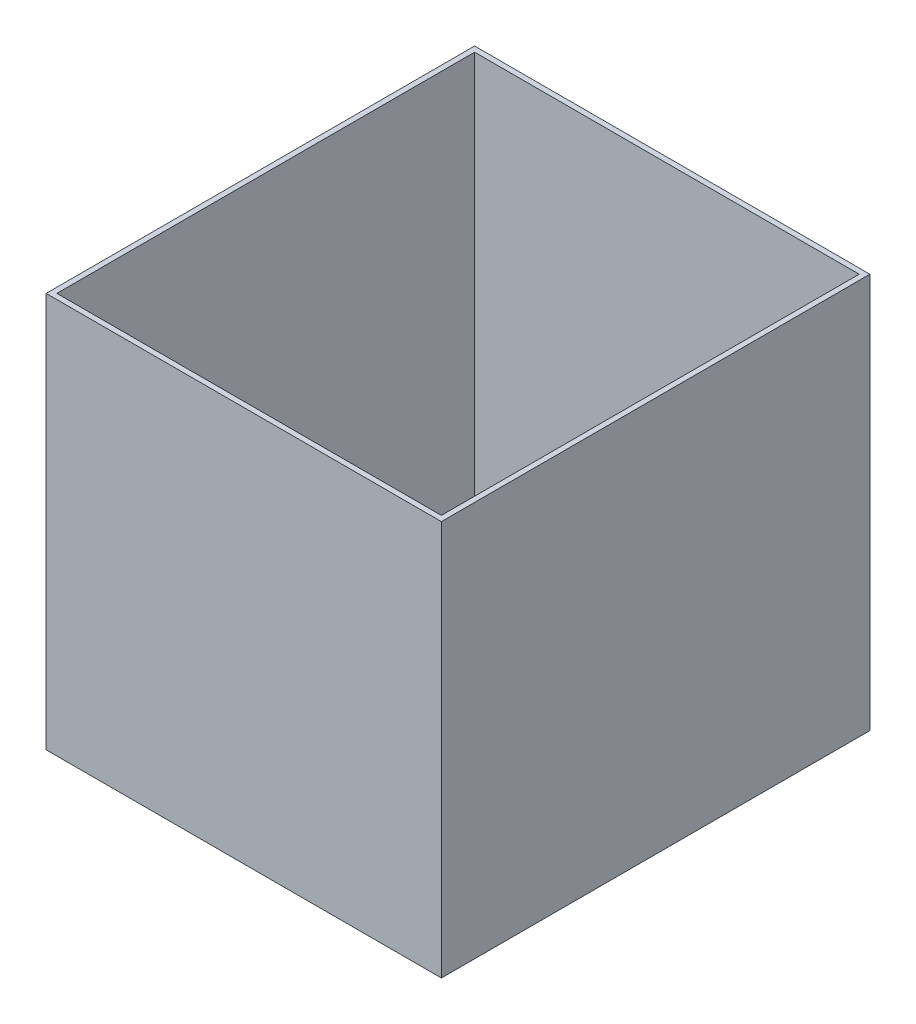
ISO-10303-21;
HEADER;
FILE_DESCRIPTION(('STEP AP214'),'2;1');
FILE_NAME('part.step','',(''),(''),'','','');
FILE_SCHEMA(('AUTOMOTIVE_DESIGN { 1 0 10303 214 1 1 1 1 }'));
ENDSEC;
DATA;
#1=APPLICATION_CONTEXT('core data for automotive mechanical design processes');
#2=APPLICATION_PROTOCOL_DEFINITION('international standard','automotive_design',2000,#1);
#3=PRODUCT_CONTEXT('',#1,'mechanical');
#4=PRODUCT('Part','Part','',(#3));
#5=PRODUCT_RELATED_PRODUCT_CATEGORY('part','',(#4));
#6=PRODUCT_DEFINITION_FORMATION('','',#4);
#7=PRODUCT_DEFINITION_CONTEXT('part definition',#1,'design');
#8=PRODUCT_DEFINITION('design','',#6,#7);
#9=PRODUCT_DEFINITION_SHAPE('','',#8);
#10=(LENGTH_UNIT() NAMED_UNIT(*) SI_UNIT(.MILLI.,.METRE.));
#11=(NAMED_UNIT(*) PLANE_ANGLE_UNIT() SI_UNIT($,.RADIAN.));
#12=(NAMED_UNIT(*) SI_UNIT($,.STERADIAN.) SOLID_ANGLE_UNIT());
#13=UNCERTAINTY_MEASURE_WITH_UNIT(LENGTH_MEASURE(1.E-05),#10,'distance_accuracy_value','');
#14=(GEOMETRIC_REPRESENTATION_CONTEXT(3) GLOBAL_UNCERTAINTY_ASSIGNED_CONTEXT((#13)) GLOBAL_UNIT_ASSIGNED_CONTEXT((#10,
#11,#12)) REPRESENTATION_CONTEXT('',''));
#15=CARTESIAN_POINT('',(0.,0.,0.));
#16=DIRECTION('',(0.,0.,1.));
#17=DIRECTION('',(1.,0.,0.));
#18=AXIS2_PLACEMENT_3D('',#15,#16,#17);
#19=CARTESIAN_POINT('',(0.,369.,-400.));
#20=DIRECTION('',(1.,0.,0.));
#21=DIRECTION('',(0.,0.,-1.));
#22=AXIS2_PLACEMENT_3D('',#19,#20,#21);
#23=PLANE('',#22);
#24=DIRECTION('',(0.,0.,1.));
#25=VECTOR('',#24,1.);
#26=CARTESIAN_POINT('',(0.,0.,-400.));
#27=LINE('',#26,#25);
#28=CARTESIAN_POINT('',(0.,0.,-400.));
#29=VERTEX_POINT('',#28);
#30=CARTESIAN_POINT('',(0.,0.,0.));
#31=VERTEX_POINT('',#30);
#32=EDGE_CURVE('E153',#29,#31,#27,.T.);
#33=ORIENTED_EDGE('',*,*,#32,.T.);
#34=DIRECTION('',(0.,-1.,0.));
#35=VECTOR('',#34,1.);
#36=CARTESIAN_POINT('',(0.,369.,0.));
#37=LINE('',#36,#35);
#38=CARTESIAN_POINT('',(0.,369.,0.));
#39=VERTEX_POINT('',#38);
#40=EDGE_CURVE('E11',#39,#31,#37,.T.);
#41=ORIENTED_EDGE('',*,*,#40,.F.);
#42=DIRECTION('',(0.,0.,1.));
#43=VECTOR('',#42,1.);
#44=CARTESIAN_POINT('',(0.,369.,-400.));
#45=LINE('',#44,#43);
#46=CARTESIAN_POINT('',(0.,369.,-400.));
#47=VERTEX_POINT('',#46);
#48=EDGE_CURVE('E146',#47,#39,#45,.T.);
#49=ORIENTED_EDGE('',*,*,#48,.F.);
#50=DIRECTION('',(0.,-1.,0.));
#51=VECTOR('',#50,1.);
#52=CARTESIAN_POINT('',(0.,369.,-400.));
#53=LINE('',#52,#51);
#54=EDGE_CURVE('E152',#47,#29,#53,.T.);
#55=ORIENTED_EDGE('',*,*,#54,.T.);
#56=EDGE_LOOP('',(#33,#41,#49,#55));
#57=FACE_BOUND('',#56,.T.);
#58=ADVANCED_FACE('F39',(#57),#23,.F.);
#59=CARTESIAN_POINT('',(0.,369.,0.));
#60=DIRECTION('',(0.,0.,-1.));
#61=DIRECTION('',(-1.,0.,0.));
#62=AXIS2_PLACEMENT_3D('',#59,#60,#61);
#63=PLANE('',#62);
#64=DIRECTION('',(1.,0.,0.));
#65=VECTOR('',#64,1.);
#66=CARTESIAN_POINT('',(0.,0.,0.));
#67=LINE('',#66,#65);
#68=CARTESIAN_POINT('',(369.,0.,0.));
#69=VERTEX_POINT('',#68);
#70=EDGE_CURVE('E156',#31,#69,#67,.T.);
#71=ORIENTED_EDGE('',*,*,#70,.T.);
#72=DIRECTION('',(0.,-1.,0.));
#73=VECTOR('',#72,1.);
#74=CARTESIAN_POINT('',(369.,369.,0.));
#75=LINE('',#74,#73);
#76=CARTESIAN_POINT('',(369.,369.,0.));
#77=VERTEX_POINT('',#76);
#78=EDGE_CURVE('E46',#77,#69,#75,.T.);
#79=ORIENTED_EDGE('',*,*,#78,.F.);
#80=DIRECTION('',(1.,0.,0.));
#81=VECTOR('',#80,1.);
#82=CARTESIAN_POINT('',(0.,369.,0.));
#83=LINE('',#82,#81);
#84=EDGE_CURVE('E90',#39,#77,#83,.T.);
#85=ORIENTED_EDGE('',*,*,#84,.F.);
#86=ORIENTED_EDGE('',*,*,#40,.T.);
#87=EDGE_LOOP('',(#71,#79,#85,#86));
#88=FACE_BOUND('',#87,.T.);
#89=ADVANCED_FACE('F185',(#88),#63,.F.);
#90=CARTESIAN_POINT('',(369.,369.,0.));
#91=DIRECTION('',(-1.,0.,0.));
#92=DIRECTION('',(0.,0.,1.));
#93=AXIS2_PLACEMENT_3D('',#90,#91,#92);
#94=PLANE('',#93);
#95=DIRECTION('',(0.,0.,-1.));
#96=VECTOR('',#95,1.);
#97=CARTESIAN_POINT('',(369.,0.,0.));
#98=LINE('',#97,#96);
#99=CARTESIAN_POINT('',(369.,0.,-400.));
#100=VERTEX_POINT('',#99);
#101=EDGE_CURVE('E158',#69,#100,#98,.T.);
#102=ORIENTED_EDGE('',*,*,#101,.T.);
#103=DIRECTION('',(0.,-1.,0.));
#104=VECTOR('',#103,1.);
#105=CARTESIAN_POINT('',(369.,369.,-400.));
#106=LINE('',#105,#104);
#107=CARTESIAN_POINT('',(369.,369.,-400.));
#108=VERTEX_POINT('',#107);
#109=EDGE_CURVE('E162',#108,#100,#106,.T.);
#110=ORIENTED_EDGE('',*,*,#109,.F.);
#111=DIRECTION('',(0.,0.,-1.));
#112=VECTOR('',#111,1.);
#113=CARTESIAN_POINT('',(369.,369.,0.));
#114=LINE('',#113,#112);
#115=EDGE_CURVE('E149',#77,#108,#114,.T.);
#116=ORIENTED_EDGE('',*,*,#115,.F.);
#117=ORIENTED_EDGE('',*,*,#78,.T.);
#118=EDGE_LOOP('',(#102,#110,#116,#117));
#119=FACE_BOUND('',#118,.T.);
#120=ADVANCED_FACE('F167',(#119),#94,.F.);
#121=CARTESIAN_POINT('',(369.,369.,-400.));
#122=DIRECTION('',(0.,0.,1.));
#123=DIRECTION('',(1.,0.,0.));
#124=AXIS2_PLACEMENT_3D('',#121,#122,#123);
#125=PLANE('',#124);
#126=DIRECTION('',(-1.,0.,0.));
#127=VECTOR('',#126,1.);
#128=CARTESIAN_POINT('',(369.,0.,-400.));
#129=LINE('',#128,#127);
#130=EDGE_CURVE('E83',#100,#29,#129,.T.);
#131=ORIENTED_EDGE('',*,*,#130,.T.);
#132=ORIENTED_EDGE('',*,*,#54,.F.);
#133=DIRECTION('',(-1.,0.,0.));
#134=VECTOR('',#133,1.);
#135=CARTESIAN_POINT('',(369.,369.,-400.));
#136=LINE('',#135,#134);
#137=EDGE_CURVE('E62',#108,#47,#136,.T.);
#138=ORIENTED_EDGE('',*,*,#137,.F.);
#139=ORIENTED_EDGE('',*,*,#109,.T.);
#140=EDGE_LOOP('',(#131,#132,#138,#139));
#141=FACE_BOUND('',#140,.T.);
#142=ADVANCED_FACE('F175',(#141),#125,.F.);
#143=CARTESIAN_POINT('',(0.,369.,0.));
#144=DIRECTION('',(0.,1.,0.));
#145=DIRECTION('',(0.,0.,1.));
#146=AXIS2_PLACEMENT_3D('',#143,#144,#145);
#147=PLANE('',#146);
#148=DIRECTION('',(0.,0.,1.));
#149=VECTOR('',#148,1.);
#150=CARTESIAN_POINT('',(5.,369.,-400.));
#151=LINE('',#150,#149);
#152=CARTESIAN_POINT('',(5.,369.,-395.));
#153=VERTEX_POINT('',#152);
#154=CARTESIAN_POINT('',(5.,369.,-5.));
#155=VERTEX_POINT('',#154);
#156=EDGE_CURVE('E135',#153,#155,#151,.T.);
#157=ORIENTED_EDGE('',*,*,#156,.F.);
#158=DIRECTION('',(-1.,0.,0.));
#159=VECTOR('',#158,1.);
#160=CARTESIAN_POINT('',(369.,369.,-395.));
#161=LINE('',#160,#159);
#162=CARTESIAN_POINT('',(364.,369.,-395.));
#163=VERTEX_POINT('',#162);
#164=EDGE_CURVE('E144',#163,#153,#161,.T.);
#165=ORIENTED_EDGE('',*,*,#164,.F.);
#166=DIRECTION('',(0.,0.,-1.));
#167=VECTOR('',#166,1.);
#168=CARTESIAN_POINT('',(364.,369.,0.));
#169=LINE('',#168,#167);
#170=CARTESIAN_POINT('',(364.,369.,-5.));
#171=VERTEX_POINT('',#170);
#172=EDGE_CURVE('E142',#171,#163,#169,.T.);
#173=ORIENTED_EDGE('',*,*,#172,.F.);
#174=DIRECTION('',(1.,0.,0.));
#175=VECTOR('',#174,1.);
#176=CARTESIAN_POINT('',(0.,369.,-5.));
#177=LINE('',#176,#175);
#178=EDGE_CURVE('E127',#155,#171,#177,.T.);
#179=ORIENTED_EDGE('',*,*,#178,.F.);
#180=EDGE_LOOP('',(#157,#165,#173,#179));
#181=FACE_BOUND('',#180,.T.);
#182=ORIENTED_EDGE('',*,*,#48,.T.);
#183=ORIENTED_EDGE('',*,*,#84,.T.);
#184=ORIENTED_EDGE('',*,*,#115,.T.);
#185=ORIENTED_EDGE('',*,*,#137,.T.);
#186=EDGE_LOOP('',(#182,#183,#184,#185));
#187=FACE_BOUND('',#186,.T.);
#188=ADVANCED_FACE('F177',(#181,#187),#147,.T.);
#189=CARTESIAN_POINT('',(0.,0.,0.));
#190=DIRECTION('',(0.,1.,0.));
#191=DIRECTION('',(0.,0.,1.));
#192=AXIS2_PLACEMENT_3D('',#189,#190,#191);
#193=PLANE('',#192);
#194=ORIENTED_EDGE('',*,*,#32,.F.);
#195=ORIENTED_EDGE('',*,*,#130,.F.);
#196=ORIENTED_EDGE('',*,*,#101,.F.);
#197=ORIENTED_EDGE('',*,*,#70,.F.);
#198=EDGE_LOOP('',(#194,#195,#196,#197));
#199=FACE_BOUND('',#198,.T.);
#200=ADVANCED_FACE('F171',(#199),#193,.F.);
#201=CARTESIAN_POINT('',(5.,369.,-400.));
#202=DIRECTION('',(1.,0.,0.));
#203=DIRECTION('',(0.,0.,-1.));
#204=AXIS2_PLACEMENT_3D('',#201,#202,#203);
#205=PLANE('',#204);
#206=DIRECTION('',(0.,0.,1.));
#207=VECTOR('',#206,1.);
#208=CARTESIAN_POINT('',(5.,5.,-400.));
#209=LINE('',#208,#207);
#210=CARTESIAN_POINT('',(5.,5.,-395.));
#211=VERTEX_POINT('',#210);
#212=CARTESIAN_POINT('',(5.,5.,-5.));
#213=VERTEX_POINT('',#212);
#214=EDGE_CURVE('E118',#211,#213,#209,.T.);
#215=ORIENTED_EDGE('',*,*,#214,.F.);
#216=DIRECTION('',(0.,-1.,0.));
#217=VECTOR('',#216,1.);
#218=CARTESIAN_POINT('',(5.,369.,-395.));
#219=LINE('',#218,#217);
#220=EDGE_CURVE('E138',#153,#211,#219,.T.);
#221=ORIENTED_EDGE('',*,*,#220,.F.);
#222=ORIENTED_EDGE('',*,*,#156,.T.);
#223=DIRECTION('',(0.,-1.,0.));
#224=VECTOR('',#223,1.);
#225=CARTESIAN_POINT('',(5.,369.,-5.));
#226=LINE('',#225,#224);
#227=EDGE_CURVE('E130',#155,#213,#226,.T.);
#228=ORIENTED_EDGE('',*,*,#227,.T.);
#229=EDGE_LOOP('',(#215,#221,#222,#228));
#230=FACE_BOUND('',#229,.T.);
#231=ADVANCED_FACE('F218',(#230),#205,.T.);
#232=CARTESIAN_POINT('',(0.,369.,-5.));
#233=DIRECTION('',(0.,0.,-1.));
#234=DIRECTION('',(-1.,0.,0.));
#235=AXIS2_PLACEMENT_3D('',#232,#233,#234);
#236=PLANE('',#235);
#237=DIRECTION('',(1.,0.,0.));
#238=VECTOR('',#237,1.);
#239=CARTESIAN_POINT('',(0.,5.,-5.));
#240=LINE('',#239,#238);
#241=CARTESIAN_POINT('',(364.,5.,-5.));
#242=VERTEX_POINT('',#241);
#243=EDGE_CURVE('E112',#213,#242,#240,.T.);
#244=ORIENTED_EDGE('',*,*,#243,.F.);
#245=ORIENTED_EDGE('',*,*,#227,.F.);
#246=ORIENTED_EDGE('',*,*,#178,.T.);
#247=DIRECTION('',(0.,-1.,0.));
#248=VECTOR('',#247,1.);
#249=CARTESIAN_POINT('',(364.,369.,-5.));
#250=LINE('',#249,#248);
#251=EDGE_CURVE('E124',#171,#242,#250,.T.);
#252=ORIENTED_EDGE('',*,*,#251,.T.);
#253=EDGE_LOOP('',(#244,#245,#246,#252));
#254=FACE_BOUND('',#253,.T.);
#255=ADVANCED_FACE('F125',(#254),#236,.T.);
#256=CARTESIAN_POINT('',(364.,369.,0.));
#257=DIRECTION('',(-1.,0.,0.));
#258=DIRECTION('',(0.,0.,1.));
#259=AXIS2_PLACEMENT_3D('',#256,#257,#258);
#260=PLANE('',#259);
#261=DIRECTION('',(0.,0.,-1.));
#262=VECTOR('',#261,1.);
#263=CARTESIAN_POINT('',(364.,5.,0.));
#264=LINE('',#263,#262);
#265=CARTESIAN_POINT('',(364.,5.,-395.));
#266=VERTEX_POINT('',#265);
#267=EDGE_CURVE('E116',#242,#266,#264,.T.);
#268=ORIENTED_EDGE('',*,*,#267,.F.);
#269=ORIENTED_EDGE('',*,*,#251,.F.);
#270=ORIENTED_EDGE('',*,*,#172,.T.);
#271=DIRECTION('',(0.,-1.,0.));
#272=VECTOR('',#271,1.);
#273=CARTESIAN_POINT('',(364.,369.,-395.));
#274=LINE('',#273,#272);
#275=EDGE_CURVE('E53',#163,#266,#274,.T.);
#276=ORIENTED_EDGE('',*,*,#275,.T.);
#277=EDGE_LOOP('',(#268,#269,#270,#276));
#278=FACE_BOUND('',#277,.T.);
#279=ADVANCED_FACE('F132',(#278),#260,.T.);
#280=CARTESIAN_POINT('',(369.,369.,-395.));
#281=DIRECTION('',(0.,0.,1.));
#282=DIRECTION('',(1.,0.,0.));
#283=AXIS2_PLACEMENT_3D('',#280,#281,#282);
#284=PLANE('',#283);
#285=DIRECTION('',(-1.,0.,0.));
#286=VECTOR('',#285,1.);
#287=CARTESIAN_POINT('',(369.,5.,-395.));
#288=LINE('',#287,#286);
#289=EDGE_CURVE('E133',#266,#211,#288,.T.);
#290=ORIENTED_EDGE('',*,*,#289,.F.);
#291=ORIENTED_EDGE('',*,*,#275,.F.);
#292=ORIENTED_EDGE('',*,*,#164,.T.);
#293=ORIENTED_EDGE('',*,*,#220,.T.);
#294=EDGE_LOOP('',(#290,#291,#292,#293));
#295=FACE_BOUND('',#294,.T.);
#296=ADVANCED_FACE('F242',(#295),#284,.T.);
#297=CARTESIAN_POINT('',(0.,5.,0.));
#298=DIRECTION('',(0.,1.,0.));
#299=DIRECTION('',(0.,0.,1.));
#300=AXIS2_PLACEMENT_3D('',#297,#298,#299);
#301=PLANE('',#300);
#302=ORIENTED_EDGE('',*,*,#214,.T.);
#303=ORIENTED_EDGE('',*,*,#243,.T.);
#304=ORIENTED_EDGE('',*,*,#267,.T.);
#305=ORIENTED_EDGE('',*,*,#289,.T.);
#306=EDGE_LOOP('',(#302,#303,#304,#305));
#307=FACE_BOUND('',#306,.T.);
#308=ADVANCED_FACE('F114',(#307),#301,.T.);
#309=CLOSED_SHELL('',(#58,#89,#120,#142,#188,#200,#231,#255,#279,#296,#308));
#310=MANIFOLD_SOLID_BREP('B2',#309);
#311=ADVANCED_BREP_SHAPE_REPRESENTATION('',(#18,#310),#14);
#312=SHAPE_DEFINITION_REPRESENTATION(#9,#311);
ENDSEC;
END-ISO-10303-21;
